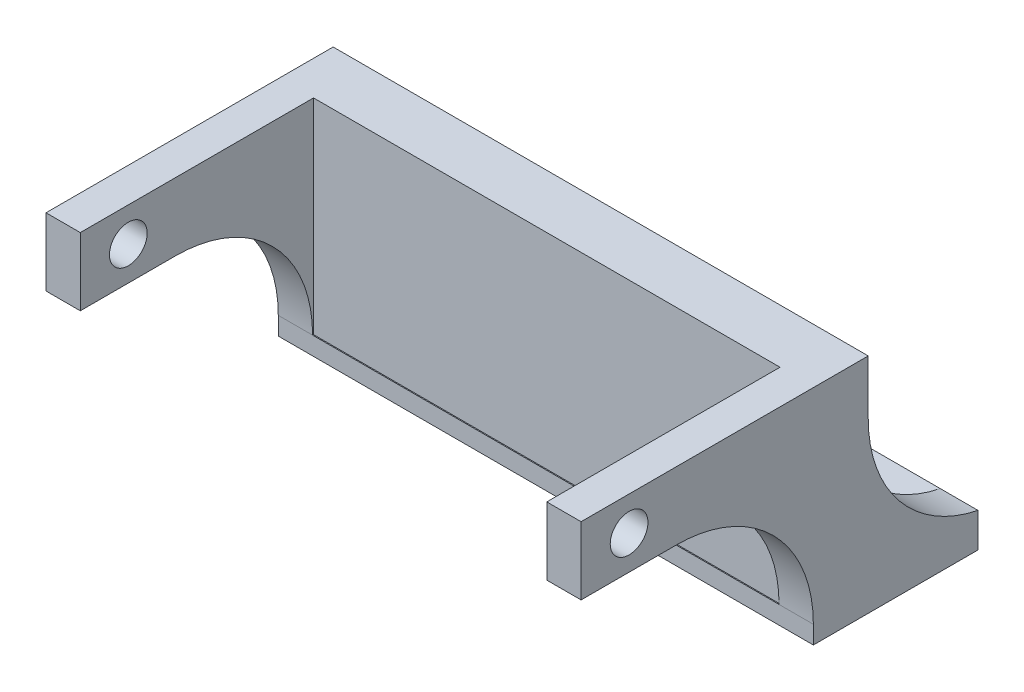
ISO-10303-21;
HEADER;
FILE_DESCRIPTION(('STEP AP214'),'2;1');
FILE_NAME('part.step','',(''),(''),'','','');
FILE_SCHEMA(('AUTOMOTIVE_DESIGN { 1 0 10303 214 1 1 1 1 }'));
ENDSEC;
DATA;
#1=APPLICATION_CONTEXT('core data for automotive mechanical design processes');
#2=APPLICATION_PROTOCOL_DEFINITION('international standard','automotive_design',2000,#1);
#3=PRODUCT_CONTEXT('',#1,'mechanical');
#4=PRODUCT('Part','Part','',(#3));
#5=PRODUCT_RELATED_PRODUCT_CATEGORY('part','',(#4));
#6=PRODUCT_DEFINITION_FORMATION('','',#4);
#7=PRODUCT_DEFINITION_CONTEXT('part definition',#1,'design');
#8=PRODUCT_DEFINITION('design','',#6,#7);
#9=PRODUCT_DEFINITION_SHAPE('','',#8);
#10=(LENGTH_UNIT() NAMED_UNIT(*) SI_UNIT(.MILLI.,.METRE.));
#11=(NAMED_UNIT(*) PLANE_ANGLE_UNIT() SI_UNIT($,.RADIAN.));
#12=(NAMED_UNIT(*) SI_UNIT($,.STERADIAN.) SOLID_ANGLE_UNIT());
#13=UNCERTAINTY_MEASURE_WITH_UNIT(LENGTH_MEASURE(1.E-05),#10,'distance_accuracy_value','');
#14=(GEOMETRIC_REPRESENTATION_CONTEXT(3) GLOBAL_UNCERTAINTY_ASSIGNED_CONTEXT((#13)) GLOBAL_UNIT_ASSIGNED_CONTEXT((#10,
#11,#12)) REPRESENTATION_CONTEXT('',''));
#15=CARTESIAN_POINT('',(0.,0.,0.));
#16=DIRECTION('',(0.,0.,1.));
#17=DIRECTION('',(1.,0.,0.));
#18=AXIS2_PLACEMENT_3D('',#15,#16,#17);
#19=CARTESIAN_POINT('',(39.,32.5,45.86));
#20=DIRECTION('',(0.,0.,1.));
#21=DIRECTION('',(1.,0.,0.));
#22=AXIS2_PLACEMENT_3D('',#19,#20,#21);
#23=PLANE('',#22);
#24=DIRECTION('',(0.,1.,0.));
#25=VECTOR('',#24,1.);
#26=CARTESIAN_POINT('',(34.,22.62,45.86));
#27=LINE('',#26,#25);
#28=CARTESIAN_POINT('',(34.,22.62,45.86));
#29=VERTEX_POINT('',#28);
#30=CARTESIAN_POINT('',(34.,32.5,45.86));
#31=VERTEX_POINT('',#30);
#32=EDGE_CURVE('E181',#29,#31,#27,.T.);
#33=ORIENTED_EDGE('',*,*,#32,.F.);
#34=DIRECTION('',(-1.,0.,0.));
#35=VECTOR('',#34,1.);
#36=CARTESIAN_POINT('',(39.,22.62,45.86));
#37=LINE('',#36,#35);
#38=CARTESIAN_POINT('',(39.,22.62,45.86));
#39=VERTEX_POINT('',#38);
#40=EDGE_CURVE('E229',#39,#29,#37,.T.);
#41=ORIENTED_EDGE('',*,*,#40,.F.);
#42=DIRECTION('',(0.,1.,0.));
#43=VECTOR('',#42,1.);
#44=CARTESIAN_POINT('',(39.,32.5,45.86));
#45=LINE('',#44,#43);
#46=CARTESIAN_POINT('',(39.,32.5,45.86));
#47=VERTEX_POINT('',#46);
#48=EDGE_CURVE('E217',#39,#47,#45,.T.);
#49=ORIENTED_EDGE('',*,*,#48,.T.);
#50=DIRECTION('',(-1.,0.,0.));
#51=VECTOR('',#50,1.);
#52=CARTESIAN_POINT('',(39.,32.5,45.86));
#53=LINE('',#52,#51);
#54=EDGE_CURVE('E225',#47,#31,#53,.T.);
#55=ORIENTED_EDGE('',*,*,#54,.T.);
#56=EDGE_LOOP('',(#33,#41,#49,#55));
#57=FACE_BOUND('',#56,.T.);
#58=ADVANCED_FACE('F33',(#57),#23,.T.);
#59=CARTESIAN_POINT('',(39.,22.62,12.));
#60=DIRECTION('',(0.,-1.,0.));
#61=DIRECTION('',(0.,0.,-1.));
#62=AXIS2_PLACEMENT_3D('',#59,#60,#61);
#63=PLANE('',#62);
#64=DIRECTION('',(0.,0.,1.));
#65=VECTOR('',#64,1.);
#66=CARTESIAN_POINT('',(34.,22.62,11.86));
#67=LINE('',#66,#65);
#68=CARTESIAN_POINT('',(34.,22.62,32.));
#69=VERTEX_POINT('',#68);
#70=EDGE_CURVE('E194',#69,#29,#67,.T.);
#71=ORIENTED_EDGE('',*,*,#70,.F.);
#72=DIRECTION('',(-1.,0.,0.));
#73=VECTOR('',#72,1.);
#74=CARTESIAN_POINT('',(39.,22.62,32.));
#75=LINE('',#74,#73);
#76=CARTESIAN_POINT('',(39.,22.62,32.));
#77=VERTEX_POINT('',#76);
#78=EDGE_CURVE('E49',#69,#77,#75,.F.);
#79=ORIENTED_EDGE('',*,*,#78,.T.);
#80=DIRECTION('',(0.,0.,1.));
#81=VECTOR('',#80,1.);
#82=CARTESIAN_POINT('',(39.,22.62,12.));
#83=LINE('',#82,#81);
#84=EDGE_CURVE('E221',#77,#39,#83,.T.);
#85=ORIENTED_EDGE('',*,*,#84,.T.);
#86=ORIENTED_EDGE('',*,*,#40,.T.);
#87=EDGE_LOOP('',(#71,#79,#85,#86));
#88=FACE_BOUND('',#87,.T.);
#89=ADVANCED_FACE('F362',(#88),#63,.T.);
#90=CARTESIAN_POINT('',(39.,27.56,38.86));
#91=DIRECTION('',(-1.,0.,0.));
#92=DIRECTION('',(0.,0.,1.));
#93=AXIS2_PLACEMENT_3D('',#90,#91,#92);
#94=CYLINDRICAL_SURFACE('',#93,2.74999999999999);
#95=CARTESIAN_POINT('',(34.,27.56,38.86));
#96=DIRECTION('',(1.,0.,0.));
#97=DIRECTION('',(0.,0.,-1.));
#98=AXIS2_PLACEMENT_3D('',#95,#96,#97);
#99=CIRCLE('',#98,2.74999999999999);
#100=CARTESIAN_POINT('',(34.,27.56,36.11));
#101=VERTEX_POINT('',#100);
#102=EDGE_CURVE('E37',#101,#101,#99,.F.);
#103=ORIENTED_EDGE('',*,*,#102,.T.);
#104=EDGE_LOOP('',(#103));
#105=FACE_BOUND('',#104,.T.);
#106=CARTESIAN_POINT('',(39.,27.56,38.86));
#107=DIRECTION('',(-1.,0.,0.));
#108=DIRECTION('',(0.,0.,1.));
#109=AXIS2_PLACEMENT_3D('',#106,#107,#108);
#110=CIRCLE('',#109,2.74999999999999);
#111=CARTESIAN_POINT('',(39.,27.56,41.61));
#112=VERTEX_POINT('',#111);
#113=EDGE_CURVE('E211',#112,#112,#110,.T.);
#114=ORIENTED_EDGE('',*,*,#113,.F.);
#115=EDGE_LOOP('',(#114));
#116=FACE_BOUND('',#115,.T.);
#117=ADVANCED_FACE('F400',(#105,#116),#94,.F.);
#118=CARTESIAN_POINT('',(-39.,2.61999999999999,32.));
#119=DIRECTION('',(-1.,0.,0.));
#120=DIRECTION('',(0.,0.,1.));
#121=AXIS2_PLACEMENT_3D('',#118,#119,#120);
#122=CYLINDRICAL_SURFACE('',#121,20.);
#123=ORIENTED_EDGE('',*,*,#78,.F.);
#124=CARTESIAN_POINT('',(34.,2.61999999999999,32.));
#125=DIRECTION('',(1.,0.,0.));
#126=DIRECTION('',(0.,0.,-1.));
#127=AXIS2_PLACEMENT_3D('',#124,#125,#126);
#128=CIRCLE('',#127,20.);
#129=CARTESIAN_POINT('',(34.,2.61999999999999,12.));
#130=VERTEX_POINT('',#129);
#131=EDGE_CURVE('E11',#69,#130,#128,.F.);
#132=ORIENTED_EDGE('',*,*,#131,.T.);
#133=DIRECTION('',(-1.,0.,0.));
#134=VECTOR('',#133,1.);
#135=CARTESIAN_POINT('',(-39.,2.61999999999999,12.));
#136=LINE('',#135,#134);
#137=CARTESIAN_POINT('',(39.,2.61999999999999,12.));
#138=VERTEX_POINT('',#137);
#139=EDGE_CURVE('E286',#138,#130,#136,.T.);
#140=ORIENTED_EDGE('',*,*,#139,.F.);
#141=CARTESIAN_POINT('',(39.,2.61999999999999,32.));
#142=DIRECTION('',(1.,0.,0.));
#143=DIRECTION('',(0.,0.,-1.));
#144=AXIS2_PLACEMENT_3D('',#141,#142,#143);
#145=CIRCLE('',#144,20.);
#146=EDGE_CURVE('E326',#77,#138,#145,.F.);
#147=ORIENTED_EDGE('',*,*,#146,.F.);
#148=EDGE_LOOP('',(#123,#132,#140,#147));
#149=FACE_BOUND('',#148,.T.);
#150=ADVANCED_FACE('F364',(#149),#122,.F.);
#151=CARTESIAN_POINT('',(0.,24.5959179422654,-16.));
#152=DIRECTION('',(1.,0.,0.));
#153=DIRECTION('',(0.,0.,-1.));
#154=AXIS2_PLACEMENT_3D('',#151,#152,#153);
#155=CYLINDRICAL_SURFACE('',#154,20.);
#156=DIRECTION('',(1.,0.,0.));
#157=VECTOR('',#156,1.);
#158=CARTESIAN_POINT('',(-39.,5.,-12.));
#159=LINE('',#158,#157);
#160=CARTESIAN_POINT('',(33.5,5.,-12.));
#161=VERTEX_POINT('',#160);
#162=CARTESIAN_POINT('',(39.,5.,-12.));
#163=VERTEX_POINT('',#162);
#164=EDGE_CURVE('E259',#161,#163,#159,.T.);
#165=ORIENTED_EDGE('',*,*,#164,.F.);
#166=CARTESIAN_POINT('',(33.5,24.5959179422654,-16.));
#167=DIRECTION('',(1.,0.,0.));
#168=DIRECTION('',(0.,1.,0.));
#169=AXIS2_PLACEMENT_3D('',#166,#167,#168);
#170=CIRCLE('',#169,20.);
#171=CARTESIAN_POINT('',(33.5,24.5959179422654,4.));
#172=VERTEX_POINT('',#171);
#173=EDGE_CURVE('E296',#161,#172,#170,.F.);
#174=ORIENTED_EDGE('',*,*,#173,.T.);
#175=DIRECTION('',(1.,0.,0.));
#176=VECTOR('',#175,1.);
#177=CARTESIAN_POINT('',(39.,24.5959179422654,4.));
#178=LINE('',#177,#176);
#179=CARTESIAN_POINT('',(39.,24.5959179422654,4.));
#180=VERTEX_POINT('',#179);
#181=EDGE_CURVE('E307',#180,#172,#178,.F.);
#182=ORIENTED_EDGE('',*,*,#181,.F.);
#183=CARTESIAN_POINT('',(39.,24.5959179422654,-16.));
#184=DIRECTION('',(1.,0.,0.));
#185=DIRECTION('',(0.,0.,-1.));
#186=AXIS2_PLACEMENT_3D('',#183,#184,#185);
#187=CIRCLE('',#186,20.);
#188=EDGE_CURVE('E303',#163,#180,#187,.F.);
#189=ORIENTED_EDGE('',*,*,#188,.F.);
#190=EDGE_LOOP('',(#165,#174,#182,#189));
#191=FACE_BOUND('',#190,.T.);
#192=ADVANCED_FACE('F357',(#191),#155,.F.);
#193=CARTESIAN_POINT('',(-39.,5.,-12.));
#194=DIRECTION('',(0.,0.,-1.));
#195=DIRECTION('',(-1.,0.,0.));
#196=AXIS2_PLACEMENT_3D('',#193,#194,#195);
#197=PLANE('',#196);
#198=DIRECTION('',(1.,0.,0.));
#199=VECTOR('',#198,1.);
#200=CARTESIAN_POINT('',(-39.,0.,-12.));
#201=LINE('',#200,#199);
#202=CARTESIAN_POINT('',(-39.,0.,-12.));
#203=VERTEX_POINT('',#202);
#204=CARTESIAN_POINT('',(39.,0.,-12.));
#205=VERTEX_POINT('',#204);
#206=EDGE_CURVE('E260',#203,#205,#201,.T.);
#207=ORIENTED_EDGE('',*,*,#206,.F.);
#208=DIRECTION('',(0.,-1.,0.));
#209=VECTOR('',#208,1.);
#210=CARTESIAN_POINT('',(-39.,5.,-12.));
#211=LINE('',#210,#209);
#212=CARTESIAN_POINT('',(-39.,5.,-12.));
#213=VERTEX_POINT('',#212);
#214=EDGE_CURVE('E273',#213,#203,#211,.T.);
#215=ORIENTED_EDGE('',*,*,#214,.F.);
#216=CARTESIAN_POINT('',(-33.5,5.00000000000001,-12.));
#217=VERTEX_POINT('',#216);
#218=EDGE_CURVE('E255',#213,#217,#159,.T.);
#219=ORIENTED_EDGE('',*,*,#218,.T.);
#220=DIRECTION('',(-1.,0.,0.));
#221=VECTOR('',#220,1.);
#222=CARTESIAN_POINT('',(33.5,5.,-12.));
#223=LINE('',#222,#221);
#224=EDGE_CURVE('E227',#161,#217,#223,.T.);
#225=ORIENTED_EDGE('',*,*,#224,.F.);
#226=ORIENTED_EDGE('',*,*,#164,.T.);
#227=DIRECTION('',(0.,-1.,0.));
#228=VECTOR('',#227,1.);
#229=CARTESIAN_POINT('',(39.,5.,-12.));
#230=LINE('',#229,#228);
#231=EDGE_CURVE('E258',#163,#205,#230,.T.);
#232=ORIENTED_EDGE('',*,*,#231,.T.);
#233=EDGE_LOOP('',(#207,#215,#219,#225,#226,#232));
#234=FACE_BOUND('',#233,.T.);
#235=ADVANCED_FACE('F335',(#234),#197,.T.);
#236=CARTESIAN_POINT('',(-39.,5.,-12.));
#237=DIRECTION('',(1.,0.,0.));
#238=DIRECTION('',(0.,0.,-1.));
#239=AXIS2_PLACEMENT_3D('',#236,#237,#238);
#240=PLANE('',#239);
#241=DIRECTION('',(0.,0.,1.));
#242=VECTOR('',#241,1.);
#243=CARTESIAN_POINT('',(-39.,0.,-12.));
#244=LINE('',#243,#242);
#245=CARTESIAN_POINT('',(-39.,0.,12.));
#246=VERTEX_POINT('',#245);
#247=EDGE_CURVE('E270',#203,#246,#244,.T.);
#248=ORIENTED_EDGE('',*,*,#247,.T.);
#249=DIRECTION('',(0.,-1.,0.));
#250=VECTOR('',#249,1.);
#251=CARTESIAN_POINT('',(-39.,5.,12.));
#252=LINE('',#251,#250);
#253=CARTESIAN_POINT('',(-39.,2.61999999999999,12.));
#254=VERTEX_POINT('',#253);
#255=EDGE_CURVE('E276',#254,#246,#252,.T.);
#256=ORIENTED_EDGE('',*,*,#255,.F.);
#257=CARTESIAN_POINT('',(-39.,2.61999999999999,32.));
#258=DIRECTION('',(1.,0.,0.));
#259=DIRECTION('',(0.,0.,-1.));
#260=AXIS2_PLACEMENT_3D('',#257,#258,#259);
#261=CIRCLE('',#260,20.);
#262=CARTESIAN_POINT('',(-39.,22.62,32.));
#263=VERTEX_POINT('',#262);
#264=EDGE_CURVE('E57',#254,#263,#261,.T.);
#265=ORIENTED_EDGE('',*,*,#264,.T.);
#266=DIRECTION('',(0.,0.,1.));
#267=VECTOR('',#266,1.);
#268=CARTESIAN_POINT('',(-39.,22.62,12.));
#269=LINE('',#268,#267);
#270=CARTESIAN_POINT('',(-39.,22.62,45.86));
#271=VERTEX_POINT('',#270);
#272=EDGE_CURVE('E214',#263,#271,#269,.T.);
#273=ORIENTED_EDGE('',*,*,#272,.T.);
#274=DIRECTION('',(0.,1.,0.));
#275=VECTOR('',#274,1.);
#276=CARTESIAN_POINT('',(-39.,32.5,45.86));
#277=LINE('',#276,#275);
#278=CARTESIAN_POINT('',(-39.,32.5,45.86));
#279=VERTEX_POINT('',#278);
#280=EDGE_CURVE('E222',#271,#279,#277,.T.);
#281=ORIENTED_EDGE('',*,*,#280,.T.);
#282=DIRECTION('',(0.,0.,1.));
#283=VECTOR('',#282,1.);
#284=CARTESIAN_POINT('',(-39.,32.5,12.));
#285=LINE('',#284,#283);
#286=CARTESIAN_POINT('',(-39.,32.5,4.00000000000001));
#287=VERTEX_POINT('',#286);
#288=EDGE_CURVE('E246',#287,#279,#285,.T.);
#289=ORIENTED_EDGE('',*,*,#288,.F.);
#290=DIRECTION('',(0.,-1.,0.));
#291=VECTOR('',#290,1.);
#292=CARTESIAN_POINT('',(-39.,32.5,4.00000000000001));
#293=LINE('',#292,#291);
#294=CARTESIAN_POINT('',(-39.,24.5959179422654,4.00000000000001));
#295=VERTEX_POINT('',#294);
#296=EDGE_CURVE('E254',#287,#295,#293,.T.);
#297=ORIENTED_EDGE('',*,*,#296,.T.);
#298=CARTESIAN_POINT('',(-39.,24.5959179422654,-16.));
#299=DIRECTION('',(1.,0.,0.));
#300=DIRECTION('',(0.,0.,-1.));
#301=AXIS2_PLACEMENT_3D('',#298,#299,#300);
#302=CIRCLE('',#301,20.);
#303=EDGE_CURVE('E305',#295,#213,#302,.T.);
#304=ORIENTED_EDGE('',*,*,#303,.T.);
#305=ORIENTED_EDGE('',*,*,#214,.T.);
#306=EDGE_LOOP('',(#248,#256,#265,#273,#281,#289,#297,#304,#305));
#307=FACE_BOUND('',#306,.T.);
#308=CARTESIAN_POINT('',(-39.,27.56,38.86));
#309=DIRECTION('',(-1.,0.,0.));
#310=DIRECTION('',(0.,0.,1.));
#311=AXIS2_PLACEMENT_3D('',#308,#309,#310);
#312=CIRCLE('',#311,2.74999999999999);
#313=CARTESIAN_POINT('',(-39.,27.56,41.61));
#314=VERTEX_POINT('',#313);
#315=EDGE_CURVE('E208',#314,#314,#312,.T.);
#316=ORIENTED_EDGE('',*,*,#315,.F.);
#317=EDGE_LOOP('',(#316));
#318=FACE_BOUND('',#317,.T.);
#319=ADVANCED_FACE('F415',(#307,#318),#240,.F.);
#320=CARTESIAN_POINT('',(-39.,5.,12.));
#321=DIRECTION('',(0.,0.,-1.));
#322=DIRECTION('',(-1.,0.,0.));
#323=AXIS2_PLACEMENT_3D('',#320,#321,#322);
#324=PLANE('',#323);
#325=DIRECTION('',(0.,-1.,0.));
#326=VECTOR('',#325,1.);
#327=CARTESIAN_POINT('',(39.,5.,12.));
#328=LINE('',#327,#326);
#329=CARTESIAN_POINT('',(39.,0.,12.));
#330=VERTEX_POINT('',#329);
#331=EDGE_CURVE('E284',#138,#330,#328,.T.);
#332=ORIENTED_EDGE('',*,*,#331,.F.);
#333=ORIENTED_EDGE('',*,*,#139,.T.);
#334=CARTESIAN_POINT('',(-34.,2.61999999999999,12.));
#335=VERTEX_POINT('',#334);
#336=EDGE_CURVE('E289',#130,#335,#136,.T.);
#337=ORIENTED_EDGE('',*,*,#336,.T.);
#338=EDGE_CURVE('E290',#335,#254,#136,.T.);
#339=ORIENTED_EDGE('',*,*,#338,.T.);
#340=ORIENTED_EDGE('',*,*,#255,.T.);
#341=DIRECTION('',(1.,0.,0.));
#342=VECTOR('',#341,1.);
#343=CARTESIAN_POINT('',(-39.,0.,12.));
#344=LINE('',#343,#342);
#345=EDGE_CURVE('E267',#246,#330,#344,.T.);
#346=ORIENTED_EDGE('',*,*,#345,.T.);
#347=EDGE_LOOP('',(#332,#333,#337,#339,#340,#346));
#348=FACE_BOUND('',#347,.T.);
#349=ADVANCED_FACE('F330',(#348),#324,.F.);
#350=CARTESIAN_POINT('',(39.,5.,-12.));
#351=DIRECTION('',(1.,0.,0.));
#352=DIRECTION('',(0.,0.,-1.));
#353=AXIS2_PLACEMENT_3D('',#350,#351,#352);
#354=PLANE('',#353);
#355=DIRECTION('',(0.,0.,1.));
#356=VECTOR('',#355,1.);
#357=CARTESIAN_POINT('',(39.,0.,-12.));
#358=LINE('',#357,#356);
#359=EDGE_CURVE('E263',#205,#330,#358,.T.);
#360=ORIENTED_EDGE('',*,*,#359,.F.);
#361=ORIENTED_EDGE('',*,*,#231,.F.);
#362=ORIENTED_EDGE('',*,*,#188,.T.);
#363=DIRECTION('',(0.,-1.,0.));
#364=VECTOR('',#363,1.);
#365=CARTESIAN_POINT('',(39.,32.5,4.));
#366=LINE('',#365,#364);
#367=CARTESIAN_POINT('',(39.,32.5,4.));
#368=VERTEX_POINT('',#367);
#369=EDGE_CURVE('E264',#368,#180,#366,.T.);
#370=ORIENTED_EDGE('',*,*,#369,.F.);
#371=DIRECTION('',(0.,0.,-1.));
#372=VECTOR('',#371,1.);
#373=CARTESIAN_POINT('',(39.,32.5,12.));
#374=LINE('',#373,#372);
#375=EDGE_CURVE('E250',#47,#368,#374,.T.);
#376=ORIENTED_EDGE('',*,*,#375,.F.);
#377=ORIENTED_EDGE('',*,*,#48,.F.);
#378=ORIENTED_EDGE('',*,*,#84,.F.);
#379=ORIENTED_EDGE('',*,*,#146,.T.);
#380=ORIENTED_EDGE('',*,*,#331,.T.);
#381=EDGE_LOOP('',(#360,#361,#362,#370,#376,#377,#378,#379,#380));
#382=FACE_BOUND('',#381,.T.);
#383=ORIENTED_EDGE('',*,*,#113,.T.);
#384=EDGE_LOOP('',(#383));
#385=FACE_BOUND('',#384,.T.);
#386=ADVANCED_FACE('F323',(#382,#385),#354,.T.);
#387=CARTESIAN_POINT('',(0.,0.,0.));
#388=DIRECTION('',(0.,-1.,0.));
#389=DIRECTION('',(0.,0.,-1.));
#390=AXIS2_PLACEMENT_3D('',#387,#388,#389);
#391=PLANE('',#390);
#392=ORIENTED_EDGE('',*,*,#206,.T.);
#393=ORIENTED_EDGE('',*,*,#359,.T.);
#394=ORIENTED_EDGE('',*,*,#345,.F.);
#395=ORIENTED_EDGE('',*,*,#247,.F.);
#396=EDGE_LOOP('',(#392,#393,#394,#395));
#397=FACE_BOUND('',#396,.T.);
#398=ADVANCED_FACE('F333',(#397),#391,.T.);
#399=CARTESIAN_POINT('',(39.,32.5,4.));
#400=DIRECTION('',(0.,0.,1.));
#401=DIRECTION('',(1.,0.,0.));
#402=AXIS2_PLACEMENT_3D('',#399,#400,#401);
#403=PLANE('',#402);
#404=ORIENTED_EDGE('',*,*,#369,.T.);
#405=ORIENTED_EDGE('',*,*,#181,.T.);
#406=DIRECTION('',(0.,-1.,0.));
#407=VECTOR('',#406,1.);
#408=CARTESIAN_POINT('',(33.5,5.,4.));
#409=LINE('',#408,#407);
#410=CARTESIAN_POINT('',(33.5,5.,4.));
#411=VERTEX_POINT('',#410);
#412=EDGE_CURVE('E232',#172,#411,#409,.T.);
#413=ORIENTED_EDGE('',*,*,#412,.T.);
#414=DIRECTION('',(-1.,0.,0.));
#415=VECTOR('',#414,1.);
#416=CARTESIAN_POINT('',(33.5,5.,4.));
#417=LINE('',#416,#415);
#418=CARTESIAN_POINT('',(-33.5,5.00000000000001,4.));
#419=VERTEX_POINT('',#418);
#420=EDGE_CURVE('E235',#411,#419,#417,.T.);
#421=ORIENTED_EDGE('',*,*,#420,.T.);
#422=DIRECTION('',(0.,1.,0.));
#423=VECTOR('',#422,1.);
#424=CARTESIAN_POINT('',(-33.5,5.00000000000001,4.));
#425=LINE('',#424,#423);
#426=CARTESIAN_POINT('',(-33.5,24.5959179422654,4.));
#427=VERTEX_POINT('',#426);
#428=EDGE_CURVE('E238',#419,#427,#425,.T.);
#429=ORIENTED_EDGE('',*,*,#428,.T.);
#430=EDGE_CURVE('E275',#427,#295,#178,.F.);
#431=ORIENTED_EDGE('',*,*,#430,.T.);
#432=ORIENTED_EDGE('',*,*,#296,.F.);
#433=DIRECTION('',(-1.,0.,0.));
#434=VECTOR('',#433,1.);
#435=CARTESIAN_POINT('',(39.,32.5,4.));
#436=LINE('',#435,#434);
#437=EDGE_CURVE('E252',#368,#287,#436,.T.);
#438=ORIENTED_EDGE('',*,*,#437,.F.);
#439=EDGE_LOOP('',(#404,#405,#413,#421,#429,#431,#432,#438));
#440=FACE_BOUND('',#439,.T.);
#441=ADVANCED_FACE('F346',(#440),#403,.F.);
#442=CARTESIAN_POINT('',(0.,32.5,0.));
#443=DIRECTION('',(0.,1.,0.));
#444=DIRECTION('',(0.,0.,1.));
#445=AXIS2_PLACEMENT_3D('',#442,#443,#444);
#446=PLANE('',#445);
#447=DIRECTION('',(0.,0.,1.));
#448=VECTOR('',#447,1.);
#449=CARTESIAN_POINT('',(34.,32.5,11.86));
#450=LINE('',#449,#448);
#451=CARTESIAN_POINT('',(34.,32.5,11.86));
#452=VERTEX_POINT('',#451);
#453=EDGE_CURVE('E176',#452,#31,#450,.T.);
#454=ORIENTED_EDGE('',*,*,#453,.T.);
#455=ORIENTED_EDGE('',*,*,#54,.F.);
#456=ORIENTED_EDGE('',*,*,#375,.T.);
#457=ORIENTED_EDGE('',*,*,#437,.T.);
#458=ORIENTED_EDGE('',*,*,#288,.T.);
#459=CARTESIAN_POINT('',(-34.,32.5,45.86));
#460=VERTEX_POINT('',#459);
#461=EDGE_CURVE('E228',#460,#279,#53,.T.);
#462=ORIENTED_EDGE('',*,*,#461,.F.);
#463=DIRECTION('',(0.,0.,1.));
#464=VECTOR('',#463,1.);
#465=CARTESIAN_POINT('',(-34.,32.5,11.86));
#466=LINE('',#465,#464);
#467=CARTESIAN_POINT('',(-34.,32.5,11.86));
#468=VERTEX_POINT('',#467);
#469=EDGE_CURVE('E185',#468,#460,#466,.T.);
#470=ORIENTED_EDGE('',*,*,#469,.F.);
#471=DIRECTION('',(-1.,0.,0.));
#472=VECTOR('',#471,1.);
#473=CARTESIAN_POINT('',(34.,32.5,11.86));
#474=LINE('',#473,#472);
#475=EDGE_CURVE('E167',#452,#468,#474,.T.);
#476=ORIENTED_EDGE('',*,*,#475,.F.);
#477=EDGE_LOOP('',(#454,#455,#456,#457,#458,#462,#470,#476));
#478=FACE_BOUND('',#477,.T.);
#479=ADVANCED_FACE('F187',(#478),#446,.T.);
#480=ORIENTED_EDGE('',*,*,#430,.F.);
#481=CARTESIAN_POINT('',(-33.5,24.5959179422654,-16.));
#482=DIRECTION('',(-1.,0.,0.));
#483=DIRECTION('',(0.,-1.,0.));
#484=AXIS2_PLACEMENT_3D('',#481,#482,#483);
#485=CIRCLE('',#484,20.);
#486=EDGE_CURVE('E300',#427,#217,#485,.F.);
#487=ORIENTED_EDGE('',*,*,#486,.T.);
#488=ORIENTED_EDGE('',*,*,#218,.F.);
#489=ORIENTED_EDGE('',*,*,#303,.F.);
#490=EDGE_LOOP('',(#480,#487,#488,#489));
#491=FACE_BOUND('',#490,.T.);
#492=ADVANCED_FACE('F341',(#491),#155,.F.);
#493=CARTESIAN_POINT('',(33.5,5.,4.));
#494=DIRECTION('',(1.,0.,0.));
#495=DIRECTION('',(0.,1.,0.));
#496=AXIS2_PLACEMENT_3D('',#493,#494,#495);
#497=PLANE('',#496);
#498=DIRECTION('',(0.,0.,-1.));
#499=VECTOR('',#498,1.);
#500=CARTESIAN_POINT('',(33.5,5.,4.));
#501=LINE('',#500,#499);
#502=EDGE_CURVE('E241',#411,#161,#501,.T.);
#503=ORIENTED_EDGE('',*,*,#502,.F.);
#504=ORIENTED_EDGE('',*,*,#412,.F.);
#505=ORIENTED_EDGE('',*,*,#173,.F.);
#506=EDGE_LOOP('',(#503,#504,#505));
#507=FACE_BOUND('',#506,.T.);
#508=ADVANCED_FACE('F446',(#507),#497,.F.);
#509=CARTESIAN_POINT('',(-33.5,5.00000000000001,4.));
#510=DIRECTION('',(-1.,0.,0.));
#511=DIRECTION('',(0.,-1.,0.));
#512=AXIS2_PLACEMENT_3D('',#509,#510,#511);
#513=PLANE('',#512);
#514=ORIENTED_EDGE('',*,*,#428,.F.);
#515=DIRECTION('',(0.,0.,-1.));
#516=VECTOR('',#515,1.);
#517=CARTESIAN_POINT('',(-33.5,5.00000000000001,4.));
#518=LINE('',#517,#516);
#519=EDGE_CURVE('E244',#419,#217,#518,.T.);
#520=ORIENTED_EDGE('',*,*,#519,.T.);
#521=ORIENTED_EDGE('',*,*,#486,.F.);
#522=EDGE_LOOP('',(#514,#520,#521));
#523=FACE_BOUND('',#522,.T.);
#524=ADVANCED_FACE('F344',(#523),#513,.F.);
#525=CARTESIAN_POINT('',(33.5,5.,4.));
#526=DIRECTION('',(0.,-1.,0.));
#527=DIRECTION('',(1.,0.,0.));
#528=AXIS2_PLACEMENT_3D('',#525,#526,#527);
#529=PLANE('',#528);
#530=ORIENTED_EDGE('',*,*,#224,.T.);
#531=ORIENTED_EDGE('',*,*,#519,.F.);
#532=ORIENTED_EDGE('',*,*,#420,.F.);
#533=ORIENTED_EDGE('',*,*,#502,.T.);
#534=EDGE_LOOP('',(#530,#531,#532,#533));
#535=FACE_BOUND('',#534,.T.);
#536=ADVANCED_FACE('F350',(#535),#529,.F.);
#537=DIRECTION('',(0.,-1.,0.));
#538=VECTOR('',#537,1.);
#539=CARTESIAN_POINT('',(-34.,22.62,45.86));
#540=LINE('',#539,#538);
#541=CARTESIAN_POINT('',(-34.,22.62,45.86));
#542=VERTEX_POINT('',#541);
#543=EDGE_CURVE('E189',#460,#542,#540,.T.);
#544=ORIENTED_EDGE('',*,*,#543,.F.);
#545=ORIENTED_EDGE('',*,*,#461,.T.);
#546=ORIENTED_EDGE('',*,*,#280,.F.);
#547=EDGE_CURVE('E220',#542,#271,#37,.T.);
#548=ORIENTED_EDGE('',*,*,#547,.F.);
#549=EDGE_LOOP('',(#544,#545,#546,#548));
#550=FACE_BOUND('',#549,.T.);
#551=ADVANCED_FACE('F396',(#550),#23,.T.);
#552=DIRECTION('',(0.,0.,1.));
#553=VECTOR('',#552,1.);
#554=CARTESIAN_POINT('',(-34.,22.62,11.86));
#555=LINE('',#554,#553);
#556=CARTESIAN_POINT('',(-34.,22.62,32.));
#557=VERTEX_POINT('',#556);
#558=EDGE_CURVE('E197',#557,#542,#555,.T.);
#559=ORIENTED_EDGE('',*,*,#558,.T.);
#560=ORIENTED_EDGE('',*,*,#547,.T.);
#561=ORIENTED_EDGE('',*,*,#272,.F.);
#562=EDGE_CURVE('E368',#263,#557,#75,.F.);
#563=ORIENTED_EDGE('',*,*,#562,.T.);
#564=EDGE_LOOP('',(#559,#560,#561,#563));
#565=FACE_BOUND('',#564,.T.);
#566=ADVANCED_FACE('F373',(#565),#63,.T.);
#567=CARTESIAN_POINT('',(-34.,27.56,38.86));
#568=DIRECTION('',(-1.,0.,0.));
#569=DIRECTION('',(0.,0.,1.));
#570=AXIS2_PLACEMENT_3D('',#567,#568,#569);
#571=CIRCLE('',#570,2.74999999999999);
#572=CARTESIAN_POINT('',(-34.,27.56,41.61));
#573=VERTEX_POINT('',#572);
#574=EDGE_CURVE('E196',#573,#573,#571,.F.);
#575=ORIENTED_EDGE('',*,*,#574,.T.);
#576=EDGE_LOOP('',(#575));
#577=FACE_BOUND('',#576,.T.);
#578=ORIENTED_EDGE('',*,*,#315,.T.);
#579=EDGE_LOOP('',(#578));
#580=FACE_BOUND('',#579,.T.);
#581=ADVANCED_FACE('F409',(#577,#580),#94,.F.);
#582=ORIENTED_EDGE('',*,*,#338,.F.);
#583=CARTESIAN_POINT('',(-34.,2.61999999999999,32.));
#584=DIRECTION('',(-1.,0.,0.));
#585=DIRECTION('',(0.,0.,1.));
#586=AXIS2_PLACEMENT_3D('',#583,#584,#585);
#587=CIRCLE('',#586,20.);
#588=EDGE_CURVE('E42',#335,#557,#587,.F.);
#589=ORIENTED_EDGE('',*,*,#588,.T.);
#590=ORIENTED_EDGE('',*,*,#562,.F.);
#591=ORIENTED_EDGE('',*,*,#264,.F.);
#592=EDGE_LOOP('',(#582,#589,#590,#591));
#593=FACE_BOUND('',#592,.T.);
#594=ADVANCED_FACE('F35',(#593),#122,.F.);
#595=CARTESIAN_POINT('',(34.,22.62,11.86));
#596=DIRECTION('',(1.,0.,0.));
#597=DIRECTION('',(0.,0.,-1.));
#598=AXIS2_PLACEMENT_3D('',#595,#596,#597);
#599=PLANE('',#598);
#600=ORIENTED_EDGE('',*,*,#131,.F.);
#601=ORIENTED_EDGE('',*,*,#70,.T.);
#602=ORIENTED_EDGE('',*,*,#32,.T.);
#603=ORIENTED_EDGE('',*,*,#453,.F.);
#604=DIRECTION('',(0.,1.,0.));
#605=VECTOR('',#604,1.);
#606=CARTESIAN_POINT('',(34.,22.62,11.86));
#607=LINE('',#606,#605);
#608=CARTESIAN_POINT('',(34.,2.61999999999999,11.86));
#609=VERTEX_POINT('',#608);
#610=EDGE_CURVE('E162',#609,#452,#607,.T.);
#611=ORIENTED_EDGE('',*,*,#610,.F.);
#612=DIRECTION('',(0.,0.,1.));
#613=VECTOR('',#612,1.);
#614=CARTESIAN_POINT('',(34.,2.61999999999999,11.86));
#615=LINE('',#614,#613);
#616=EDGE_CURVE('E206',#609,#130,#615,.T.);
#617=ORIENTED_EDGE('',*,*,#616,.T.);
#618=EDGE_LOOP('',(#600,#601,#602,#603,#611,#617));
#619=FACE_BOUND('',#618,.T.);
#620=ORIENTED_EDGE('',*,*,#102,.F.);
#621=EDGE_LOOP('',(#620));
#622=FACE_BOUND('',#621,.T.);
#623=ADVANCED_FACE('F178',(#619,#622),#599,.F.);
#624=CARTESIAN_POINT('',(34.,2.61999999999999,11.86));
#625=DIRECTION('',(0.,-1.,0.));
#626=DIRECTION('',(0.,0.,-1.));
#627=AXIS2_PLACEMENT_3D('',#624,#625,#626);
#628=PLANE('',#627);
#629=ORIENTED_EDGE('',*,*,#616,.F.);
#630=DIRECTION('',(1.,0.,0.));
#631=VECTOR('',#630,1.);
#632=CARTESIAN_POINT('',(34.,2.61999999999999,11.86));
#633=LINE('',#632,#631);
#634=CARTESIAN_POINT('',(-34.,2.61999999999999,11.86));
#635=VERTEX_POINT('',#634);
#636=EDGE_CURVE('E170',#635,#609,#633,.T.);
#637=ORIENTED_EDGE('',*,*,#636,.F.);
#638=DIRECTION('',(0.,0.,1.));
#639=VECTOR('',#638,1.);
#640=CARTESIAN_POINT('',(-34.,2.61999999999999,11.86));
#641=LINE('',#640,#639);
#642=EDGE_CURVE('E205',#635,#335,#641,.T.);
#643=ORIENTED_EDGE('',*,*,#642,.T.);
#644=ORIENTED_EDGE('',*,*,#336,.F.);
#645=EDGE_LOOP('',(#629,#637,#643,#644));
#646=FACE_BOUND('',#645,.T.);
#647=ADVANCED_FACE('F382',(#646),#628,.F.);
#648=CARTESIAN_POINT('',(-34.,22.62,11.86));
#649=DIRECTION('',(-1.,0.,0.));
#650=DIRECTION('',(0.,0.,1.));
#651=AXIS2_PLACEMENT_3D('',#648,#649,#650);
#652=PLANE('',#651);
#653=ORIENTED_EDGE('',*,*,#642,.F.);
#654=DIRECTION('',(0.,-1.,0.));
#655=VECTOR('',#654,1.);
#656=CARTESIAN_POINT('',(-34.,22.62,11.86));
#657=LINE('',#656,#655);
#658=EDGE_CURVE('E173',#468,#635,#657,.T.);
#659=ORIENTED_EDGE('',*,*,#658,.F.);
#660=ORIENTED_EDGE('',*,*,#469,.T.);
#661=ORIENTED_EDGE('',*,*,#543,.T.);
#662=ORIENTED_EDGE('',*,*,#558,.F.);
#663=ORIENTED_EDGE('',*,*,#588,.F.);
#664=EDGE_LOOP('',(#653,#659,#660,#661,#662,#663));
#665=FACE_BOUND('',#664,.T.);
#666=ORIENTED_EDGE('',*,*,#574,.F.);
#667=EDGE_LOOP('',(#666));
#668=FACE_BOUND('',#667,.T.);
#669=ADVANCED_FACE('F379',(#665,#668),#652,.F.);
#670=CARTESIAN_POINT('',(0.,0.,11.86));
#671=DIRECTION('',(0.,0.,-1.));
#672=DIRECTION('',(-1.,0.,0.));
#673=AXIS2_PLACEMENT_3D('',#670,#671,#672);
#674=PLANE('',#673);
#675=ORIENTED_EDGE('',*,*,#610,.T.);
#676=ORIENTED_EDGE('',*,*,#475,.T.);
#677=ORIENTED_EDGE('',*,*,#658,.T.);
#678=ORIENTED_EDGE('',*,*,#636,.T.);
#679=EDGE_LOOP('',(#675,#676,#677,#678));
#680=FACE_BOUND('',#679,.T.);
#681=ADVANCED_FACE('F164',(#680),#674,.F.);
#682=CLOSED_SHELL('',(#58,#89,#117,#150,#192,#235,#319,#349,#386,#398,#441,#479,#492,#508,#524,
#536,#551,#566,#581,#594,#623,#647,#669,#681));
#683=MANIFOLD_SOLID_BREP('B2',#682);
#684=ADVANCED_BREP_SHAPE_REPRESENTATION('',(#18,#683),#14);
#685=SHAPE_DEFINITION_REPRESENTATION(#9,#684);
ENDSEC;
END-ISO-10303-21;
